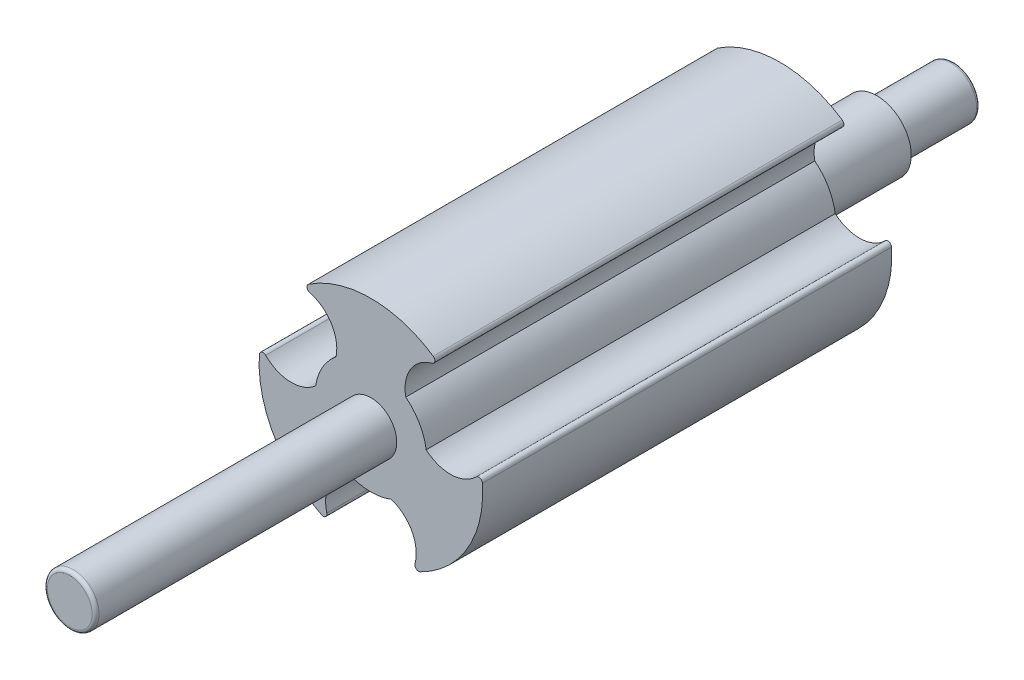
ISO-10303-21;
HEADER;
FILE_DESCRIPTION(('STEP AP214'),'2;1');
FILE_NAME('part.step','',(''),(''),'','','');
FILE_SCHEMA(('AUTOMOTIVE_DESIGN { 1 0 10303 214 1 1 1 1 }'));
ENDSEC;
DATA;
#1=APPLICATION_CONTEXT('core data for automotive mechanical design processes');
#2=APPLICATION_PROTOCOL_DEFINITION('international standard','automotive_design',2000,#1);
#3=PRODUCT_CONTEXT('',#1,'mechanical');
#4=PRODUCT('Part','Part','',(#3));
#5=PRODUCT_RELATED_PRODUCT_CATEGORY('part','',(#4));
#6=PRODUCT_DEFINITION_FORMATION('','',#4);
#7=PRODUCT_DEFINITION_CONTEXT('part definition',#1,'design');
#8=PRODUCT_DEFINITION('design','',#6,#7);
#9=PRODUCT_DEFINITION_SHAPE('','',#8);
#10=(LENGTH_UNIT() NAMED_UNIT(*) SI_UNIT(.MILLI.,.METRE.));
#11=(NAMED_UNIT(*) PLANE_ANGLE_UNIT() SI_UNIT($,.RADIAN.));
#12=(NAMED_UNIT(*) SI_UNIT($,.STERADIAN.) SOLID_ANGLE_UNIT());
#13=UNCERTAINTY_MEASURE_WITH_UNIT(LENGTH_MEASURE(1.E-05),#10,'distance_accuracy_value','');
#14=(GEOMETRIC_REPRESENTATION_CONTEXT(3) GLOBAL_UNCERTAINTY_ASSIGNED_CONTEXT((#13)) GLOBAL_UNIT_ASSIGNED_CONTEXT((#10,
#11,#12)) REPRESENTATION_CONTEXT('',''));
#15=CARTESIAN_POINT('',(0.,0.,0.));
#16=DIRECTION('',(0.,0.,1.));
#17=DIRECTION('',(1.,0.,0.));
#18=AXIS2_PLACEMENT_3D('',#15,#16,#17);
#19=CARTESIAN_POINT('',(0.,0.,-23.7702127659574));
#20=DIRECTION('',(0.,0.,1.));
#21=DIRECTION('',(0.999999999999999,0.,0.));
#22=AXIS2_PLACEMENT_3D('',#19,#20,#21);
#23=CYLINDRICAL_SURFACE('',#22,6.5);
#24=CARTESIAN_POINT('',(0.,0.,-23.7702127659574));
#25=DIRECTION('',(0.,0.,-1.));
#26=DIRECTION('',(-0.999999999999999,0.,0.));
#27=AXIS2_PLACEMENT_3D('',#24,#25,#26);
#28=CIRCLE('',#27,6.5);
#29=CARTESIAN_POINT('',(-3.6185596515465,5.39963202896276,-23.7702127659578));
#30=VERTEX_POINT('',#29);
#31=CARTESIAN_POINT('',(3.61855965154639,5.39963202896276,-23.7702127659578));
#32=VERTEX_POINT('',#31);
#33=EDGE_CURVE('E233',#30,#32,#28,.T.);
#34=ORIENTED_EDGE('',*,*,#33,.F.);
#35=DIRECTION('',(0.,0.,1.));
#36=VECTOR('',#35,1.);
#37=CARTESIAN_POINT('',(-3.6185596515465,5.39963202896276,-23.7702127659578));
#38=LINE('',#37,#36);
#39=CARTESIAN_POINT('',(-3.61855965154656,5.39963202896288,-3.05311331771918E-13));
#40=VERTEX_POINT('',#39);
#41=EDGE_CURVE('E371',#30,#40,#38,.T.);
#42=ORIENTED_EDGE('',*,*,#41,.T.);
#43=CARTESIAN_POINT('',(0.,0.,0.));
#44=DIRECTION('',(0.,0.,-1.));
#45=DIRECTION('',(-0.999999999999999,0.,0.));
#46=AXIS2_PLACEMENT_3D('',#43,#44,#45);
#47=CIRCLE('',#46,6.5);
#48=CARTESIAN_POINT('',(3.61855965154639,5.39963202896276,0.));
#49=VERTEX_POINT('',#48);
#50=EDGE_CURVE('E266',#40,#49,#47,.T.);
#51=ORIENTED_EDGE('',*,*,#50,.T.);
#52=DIRECTION('',(0.,0.,1.));
#53=VECTOR('',#52,1.);
#54=CARTESIAN_POINT('',(3.61855965154623,5.39963202896282,-23.7702127659578));
#55=LINE('',#54,#53);
#56=EDGE_CURVE('E361',#49,#32,#55,.F.);
#57=ORIENTED_EDGE('',*,*,#56,.T.);
#58=EDGE_LOOP('',(#34,#42,#51,#57));
#59=FACE_BOUND('',#58,.T.);
#60=ADVANCED_FACE('F47',(#59),#23,.T.);
#61=CARTESIAN_POINT('',(4.10030401471878,2.9653202043799,-23.7702127659578));
#62=DIRECTION('',(0.,0.,1.));
#63=DIRECTION('',(0.999999999999999,0.,0.));
#64=AXIS2_PLACEMENT_3D('',#61,#62,#63);
#65=CYLINDRICAL_SURFACE('',#64,2.11674677928763);
#66=CARTESIAN_POINT('',(4.10030401471878,2.9653202043799,-23.7702127659578));
#67=DIRECTION('',(0.,0.,1.));
#68=DIRECTION('',(0.999999999999999,0.,0.));
#69=AXIS2_PLACEMENT_3D('',#66,#67,#68);
#70=CIRCLE('',#69,2.11674677928763);
#71=CARTESIAN_POINT('',(3.55387278496899,5.01032138745486,-23.7702127659578));
#72=VERTEX_POINT('',#71);
#73=CARTESIAN_POINT('',(2.02656954019909,2.54077072927433,-23.7702127659578));
#74=VERTEX_POINT('',#73);
#75=EDGE_CURVE('E228',#72,#74,#70,.T.);
#76=ORIENTED_EDGE('',*,*,#75,.F.);
#77=DIRECTION('',(0.,0.,1.));
#78=VECTOR('',#77,1.);
#79=CARTESIAN_POINT('',(3.55387278496899,5.01032138745486,-23.7702127659578));
#80=LINE('',#79,#78);
#81=CARTESIAN_POINT('',(3.5538727849691,5.01032138745483,0.));
#82=VERTEX_POINT('',#81);
#83=EDGE_CURVE('E255',#72,#82,#80,.T.);
#84=ORIENTED_EDGE('',*,*,#83,.T.);
#85=CARTESIAN_POINT('',(4.10030401471911,2.9653202043797,-3.33066907387547E-13));
#86=DIRECTION('',(0.,0.,1.));
#87=DIRECTION('',(0.999999999999999,0.,0.));
#88=AXIS2_PLACEMENT_3D('',#85,#86,#87);
#89=CIRCLE('',#88,2.11674677928763);
#90=CARTESIAN_POINT('',(2.0265695401992,2.54077072927431,-3.05311331771918E-13));
#91=VERTEX_POINT('',#90);
#92=EDGE_CURVE('E261',#82,#91,#89,.T.);
#93=ORIENTED_EDGE('',*,*,#92,.T.);
#94=DIRECTION('',(0.,0.,1.));
#95=VECTOR('',#94,1.);
#96=CARTESIAN_POINT('',(2.02656954019909,2.54077072927433,-23.7702127659578));
#97=LINE('',#96,#95);
#98=EDGE_CURVE('E267',#74,#91,#97,.T.);
#99=ORIENTED_EDGE('',*,*,#98,.F.);
#100=EDGE_LOOP('',(#76,#84,#93,#99));
#101=FACE_BOUND('',#100,.T.);
#102=ADVANCED_FACE('F406',(#101),#65,.F.);
#103=CARTESIAN_POINT('',(0.,0.,-23.7702127659574));
#104=DIRECTION('',(0.,0.,1.));
#105=DIRECTION('',(0.999999999999999,0.,0.));
#106=AXIS2_PLACEMENT_3D('',#103,#104,#105);
#107=CYLINDRICAL_SURFACE('',#106,3.25);
#108=CARTESIAN_POINT('',(0.,0.,0.));
#109=DIRECTION('',(0.,0.,-1.));
#110=DIRECTION('',(-0.999999999999999,0.,0.));
#111=AXIS2_PLACEMENT_3D('',#108,#109,#110);
#112=CIRCLE('',#111,3.25);
#113=CARTESIAN_POINT('',(3.21365676684293,0.484675339711582,-3.05311331771918E-13));
#114=VERTEX_POINT('',#113);
#115=EDGE_CURVE('E265',#91,#114,#112,.T.);
#116=ORIENTED_EDGE('',*,*,#115,.T.);
#117=DIRECTION('',(0.,0.,1.));
#118=VECTOR('',#117,1.);
#119=CARTESIAN_POINT('',(3.21365676684282,0.484675339711416,-23.7702127659578));
#120=LINE('',#119,#118);
#121=CARTESIAN_POINT('',(3.21365676684282,0.484675339711416,-23.7702127659578));
#122=VERTEX_POINT('',#121);
#123=EDGE_CURVE('E271',#122,#114,#120,.T.);
#124=ORIENTED_EDGE('',*,*,#123,.F.);
#125=CARTESIAN_POINT('',(0.,0.,-23.7702127659575));
#126=DIRECTION('',(0.,0.,-1.));
#127=DIRECTION('',(-0.999999999999999,0.,0.));
#128=AXIS2_PLACEMENT_3D('',#125,#126,#127);
#129=CIRCLE('',#128,3.25);
#130=EDGE_CURVE('E232',#74,#122,#129,.T.);
#131=ORIENTED_EDGE('',*,*,#130,.F.);
#132=ORIENTED_EDGE('',*,*,#98,.T.);
#133=EDGE_LOOP('',(#116,#124,#131,#132));
#134=FACE_BOUND('',#133,.T.);
#135=ADVANCED_FACE('F412',(#134),#107,.T.);
#136=CARTESIAN_POINT('',(4.61819463470758,2.06830733779634,-23.7702127659578));
#137=DIRECTION('',(0.,0.,1.));
#138=DIRECTION('',(0.999999999999999,0.,0.));
#139=AXIS2_PLACEMENT_3D('',#136,#137,#138);
#140=CYLINDRICAL_SURFACE('',#139,2.11674677928763);
#141=CARTESIAN_POINT('',(4.61819463470764,2.06830733779634,-3.33066907387547E-13));
#142=DIRECTION('',(0.,0.,1.));
#143=DIRECTION('',(0.999999999999999,0.,0.));
#144=AXIS2_PLACEMENT_3D('',#141,#142,#143);
#145=CIRCLE('',#144,2.11674677928763);
#146=CARTESIAN_POINT('',(6.11600199514467,0.572583419874317,-3.33066907387547E-13));
#147=VERTEX_POINT('',#146);
#148=EDGE_CURVE('E275',#114,#147,#145,.T.);
#149=ORIENTED_EDGE('',*,*,#148,.T.);
#150=DIRECTION('',(0.,0.,1.));
#151=VECTOR('',#150,1.);
#152=CARTESIAN_POINT('',(6.11600199514462,0.572583419874262,-23.7702127659578));
#153=LINE('',#152,#151);
#154=CARTESIAN_POINT('',(6.11600199514462,0.572583419874262,-23.7702127659578));
#155=VERTEX_POINT('',#154);
#156=EDGE_CURVE('E284',#147,#155,#153,.F.);
#157=ORIENTED_EDGE('',*,*,#156,.T.);
#158=CARTESIAN_POINT('',(4.61819463470758,2.06830733779634,-23.7702127659578));
#159=DIRECTION('',(0.,0.,1.));
#160=DIRECTION('',(0.999999999999999,0.,0.));
#161=AXIS2_PLACEMENT_3D('',#158,#159,#160);
#162=CIRCLE('',#161,2.11674677928763);
#163=EDGE_CURVE('E237',#122,#155,#162,.T.);
#164=ORIENTED_EDGE('',*,*,#163,.F.);
#165=ORIENTED_EDGE('',*,*,#123,.T.);
#166=EDGE_LOOP('',(#149,#157,#164,#165));
#167=FACE_BOUND('',#166,.T.);
#168=ADVANCED_FACE('F422',(#167),#140,.F.);
#169=CARTESIAN_POINT('',(0.,0.,-23.7702127659574));
#170=DIRECTION('',(0.,0.,1.));
#171=DIRECTION('',(0.999999999999999,0.,0.));
#172=AXIS2_PLACEMENT_3D('',#169,#170,#171);
#173=CYLINDRICAL_SURFACE('',#172,6.5);
#174=CARTESIAN_POINT('',(0.,0.,0.));
#175=DIRECTION('',(0.,0.,-1.));
#176=DIRECTION('',(-0.999999999999999,0.,0.));
#177=AXIS2_PLACEMENT_3D('',#174,#175,#176);
#178=CIRCLE('',#177,6.5);
#179=CARTESIAN_POINT('',(6.48549833394302,0.433948568867304,-3.33066907387547E-13));
#180=VERTEX_POINT('',#179);
#181=CARTESIAN_POINT('',(2.86693868239657,-5.83358059782985,0.));
#182=VERTEX_POINT('',#181);
#183=EDGE_CURVE('E283',#180,#182,#178,.T.);
#184=ORIENTED_EDGE('',*,*,#183,.T.);
#185=DIRECTION('',(0.,0.,1.));
#186=VECTOR('',#185,1.);
#187=CARTESIAN_POINT('',(2.86693868239657,-5.83358059782985,-23.7702127659574));
#188=LINE('',#187,#186);
#189=CARTESIAN_POINT('',(2.86693868239657,-5.83358059782985,-23.7702127659574));
#190=VERTEX_POINT('',#189);
#191=EDGE_CURVE('E289',#182,#190,#188,.F.);
#192=ORIENTED_EDGE('',*,*,#191,.T.);
#193=CARTESIAN_POINT('',(0.,0.,-23.7702127659574));
#194=DIRECTION('',(0.,0.,-1.));
#195=DIRECTION('',(-0.999999999999999,0.,0.));
#196=AXIS2_PLACEMENT_3D('',#193,#194,#195);
#197=CIRCLE('',#196,6.5);
#198=CARTESIAN_POINT('',(6.48549833394302,0.433948568867304,-23.7702127659578));
#199=VERTEX_POINT('',#198);
#200=EDGE_CURVE('E241',#199,#190,#197,.T.);
#201=ORIENTED_EDGE('',*,*,#200,.F.);
#202=DIRECTION('',(0.,0.,1.));
#203=VECTOR('',#202,1.);
#204=CARTESIAN_POINT('',(6.48549833394302,0.433948568867304,-23.7702127659578));
#205=LINE('',#204,#203);
#206=EDGE_CURVE('E339',#199,#180,#205,.T.);
#207=ORIENTED_EDGE('',*,*,#206,.T.);
#208=EDGE_LOOP('',(#184,#192,#201,#207));
#209=FACE_BOUND('',#208,.T.);
#210=ADVANCED_FACE('F426',(#209),#173,.T.);
#211=CARTESIAN_POINT('',(0.517890619988137,-5.03362754217568,-23.7702127659575));
#212=DIRECTION('',(0.,0.,1.));
#213=DIRECTION('',(0.999999999999999,0.,0.));
#214=AXIS2_PLACEMENT_3D('',#211,#212,#213);
#215=CYLINDRICAL_SURFACE('',#214,2.11674677928763);
#216=CARTESIAN_POINT('',(0.517890619988137,-5.03362754217568,-23.7702127659575));
#217=DIRECTION('',(0.,0.,1.));
#218=DIRECTION('',(0.999999999999999,0.,0.));
#219=AXIS2_PLACEMENT_3D('',#216,#217,#218);
#220=CIRCLE('',#219,2.11674677928763);
#221=CARTESIAN_POINT('',(2.5621292101754,-5.58290480732832,-23.7702127659574));
#222=VERTEX_POINT('',#221);
#223=CARTESIAN_POINT('',(1.18708722664335,-3.02544606898508,-23.7702127659574));
#224=VERTEX_POINT('',#223);
#225=EDGE_CURVE('E247',#222,#224,#220,.T.);
#226=ORIENTED_EDGE('',*,*,#225,.F.);
#227=DIRECTION('',(0.,0.,1.));
#228=VECTOR('',#227,1.);
#229=CARTESIAN_POINT('',(2.5621292101754,-5.58290480732832,-23.7702127659574));
#230=LINE('',#229,#228);
#231=CARTESIAN_POINT('',(2.56212921017562,-5.58290480732854,0.));
#232=VERTEX_POINT('',#231);
#233=EDGE_CURVE('E186',#222,#232,#230,.T.);
#234=ORIENTED_EDGE('',*,*,#233,.T.);
#235=CARTESIAN_POINT('',(0.517890619988415,-5.03362754217584,0.));
#236=DIRECTION('',(0.,0.,1.));
#237=DIRECTION('',(0.999999999999999,0.,0.));
#238=AXIS2_PLACEMENT_3D('',#235,#236,#237);
#239=CIRCLE('',#238,2.11674677928763);
#240=CARTESIAN_POINT('',(1.18708722664357,-3.02544606898514,0.));
#241=VERTEX_POINT('',#240);
#242=EDGE_CURVE('E305',#232,#241,#239,.T.);
#243=ORIENTED_EDGE('',*,*,#242,.T.);
#244=DIRECTION('',(0.,0.,1.));
#245=VECTOR('',#244,1.);
#246=CARTESIAN_POINT('',(1.18708722664335,-3.02544606898508,-23.7702127659574));
#247=LINE('',#246,#245);
#248=EDGE_CURVE('E279',#224,#241,#247,.T.);
#249=ORIENTED_EDGE('',*,*,#248,.F.);
#250=EDGE_LOOP('',(#226,#234,#243,#249));
#251=FACE_BOUND('',#250,.T.);
#252=ADVANCED_FACE('F430',(#251),#215,.F.);
#253=CARTESIAN_POINT('',(0.,0.,-23.7702127659574));
#254=DIRECTION('',(0.,0.,1.));
#255=DIRECTION('',(0.999999999999999,0.,0.));
#256=AXIS2_PLACEMENT_3D('',#253,#254,#255);
#257=CYLINDRICAL_SURFACE('',#256,3.25);
#258=CARTESIAN_POINT('',(0.,0.,0.));
#259=DIRECTION('',(0.,0.,-1.));
#260=DIRECTION('',(-0.999999999999999,0.,0.));
#261=AXIS2_PLACEMENT_3D('',#258,#259,#260);
#262=CIRCLE('',#261,3.25);
#263=CARTESIAN_POINT('',(-1.18708722664373,-3.0254460689853,0.));
#264=VERTEX_POINT('',#263);
#265=EDGE_CURVE('E301',#241,#264,#262,.T.);
#266=ORIENTED_EDGE('',*,*,#265,.T.);
#267=DIRECTION('',(0.,0.,1.));
#268=VECTOR('',#267,1.);
#269=CARTESIAN_POINT('',(-1.18708722664379,-3.02544606898536,-23.7702127659575));
#270=LINE('',#269,#268);
#271=CARTESIAN_POINT('',(-1.18708722664379,-3.02544606898536,-23.7702127659575));
#272=VERTEX_POINT('',#271);
#273=EDGE_CURVE('E349',#272,#264,#270,.T.);
#274=ORIENTED_EDGE('',*,*,#273,.F.);
#275=CARTESIAN_POINT('',(0.,0.,-23.7702127659574));
#276=DIRECTION('',(0.,0.,-1.));
#277=DIRECTION('',(0.,1.,0.));
#278=AXIS2_PLACEMENT_3D('',#275,#276,#277);
#279=CIRCLE('',#278,3.25);
#280=EDGE_CURVE('E209',#224,#272,#279,.T.);
#281=ORIENTED_EDGE('',*,*,#280,.F.);
#282=ORIENTED_EDGE('',*,*,#248,.T.);
#283=EDGE_LOOP('',(#266,#274,#281,#282));
#284=FACE_BOUND('',#283,.T.);
#285=ADVANCED_FACE('F434',(#284),#257,.T.);
#286=CARTESIAN_POINT('',(-0.517890619988581,-5.03362754217587,-23.7702127659578));
#287=DIRECTION('',(0.,0.,1.));
#288=DIRECTION('',(0.999999999999999,0.,0.));
#289=AXIS2_PLACEMENT_3D('',#286,#287,#288);
#290=CYLINDRICAL_SURFACE('',#289,2.11674677928763);
#291=CARTESIAN_POINT('',(-0.517890619988526,-5.0336275421759,0.));
#292=DIRECTION('',(0.,0.,1.));
#293=DIRECTION('',(0.999999999999999,0.,0.));
#294=AXIS2_PLACEMENT_3D('',#291,#292,#293);
#295=CIRCLE('',#294,2.11674677928763);
#296=CARTESIAN_POINT('',(-2.56212921017585,-5.5829048073287,-3.33066907387547E-13));
#297=VERTEX_POINT('',#296);
#298=EDGE_CURVE('E294',#264,#297,#295,.T.);
#299=ORIENTED_EDGE('',*,*,#298,.T.);
#300=DIRECTION('',(0.,0.,1.));
#301=VECTOR('',#300,1.);
#302=CARTESIAN_POINT('',(-2.56212921017601,-5.58290480732854,-23.7702127659578));
#303=LINE('',#302,#301);
#304=CARTESIAN_POINT('',(-2.56212921017601,-5.58290480732854,-23.7702127659578));
#305=VERTEX_POINT('',#304);
#306=EDGE_CURVE('E227',#297,#305,#303,.F.);
#307=ORIENTED_EDGE('',*,*,#306,.T.);
#308=CARTESIAN_POINT('',(-0.517890619988581,-5.03362754217587,-23.7702127659578));
#309=DIRECTION('',(0.,0.,1.));
#310=DIRECTION('',(0.999999999999999,0.,0.));
#311=AXIS2_PLACEMENT_3D('',#308,#309,#310);
#312=CIRCLE('',#311,2.11674677928763);
#313=EDGE_CURVE('E181',#272,#305,#312,.T.);
#314=ORIENTED_EDGE('',*,*,#313,.F.);
#315=ORIENTED_EDGE('',*,*,#273,.T.);
#316=EDGE_LOOP('',(#299,#307,#314,#315));
#317=FACE_BOUND('',#316,.T.);
#318=ADVANCED_FACE('F438',(#317),#290,.F.);
#319=CARTESIAN_POINT('',(0.,0.,-23.7702127659574));
#320=DIRECTION('',(0.,0.,1.));
#321=DIRECTION('',(0.999999999999999,0.,0.));
#322=AXIS2_PLACEMENT_3D('',#319,#320,#321);
#323=CYLINDRICAL_SURFACE('',#322,6.5);
#324=CARTESIAN_POINT('',(0.,0.,-23.7702127659574));
#325=DIRECTION('',(0.,0.,-1.));
#326=DIRECTION('',(-0.999999999999999,0.,0.));
#327=AXIS2_PLACEMENT_3D('',#324,#325,#326);
#328=CIRCLE('',#327,6.5);
#329=CARTESIAN_POINT('',(-2.86693868239668,-5.83358059782985,-23.7702127659578));
#330=VERTEX_POINT('',#329);
#331=CARTESIAN_POINT('',(-6.48549833394324,0.433948568867387,-23.7702127659578));
#332=VERTEX_POINT('',#331);
#333=EDGE_CURVE('E179',#330,#332,#328,.T.);
#334=ORIENTED_EDGE('',*,*,#333,.F.);
#335=DIRECTION('',(0.,0.,1.));
#336=VECTOR('',#335,1.);
#337=CARTESIAN_POINT('',(-2.86693868239668,-5.83358059782985,-23.7702127659578));
#338=LINE('',#337,#336);
#339=CARTESIAN_POINT('',(-2.86693868239685,-5.83358059782976,-3.33066907387547E-13));
#340=VERTEX_POINT('',#339);
#341=EDGE_CURVE('E190',#330,#340,#338,.T.);
#342=ORIENTED_EDGE('',*,*,#341,.T.);
#343=CARTESIAN_POINT('',(0.,0.,0.));
#344=DIRECTION('',(0.,0.,-1.));
#345=DIRECTION('',(-0.999999999999999,0.,0.));
#346=AXIS2_PLACEMENT_3D('',#343,#344,#345);
#347=CIRCLE('',#346,6.5);
#348=CARTESIAN_POINT('',(-6.48549833394324,0.433948568867387,0.));
#349=VERTEX_POINT('',#348);
#350=EDGE_CURVE('E290',#340,#349,#347,.T.);
#351=ORIENTED_EDGE('',*,*,#350,.T.);
#352=DIRECTION('',(0.,0.,1.));
#353=VECTOR('',#352,1.);
#354=CARTESIAN_POINT('',(-6.48549833394324,0.433948568867387,-23.7702127659578));
#355=LINE('',#354,#353);
#356=EDGE_CURVE('E198',#349,#332,#355,.F.);
#357=ORIENTED_EDGE('',*,*,#356,.T.);
#358=EDGE_LOOP('',(#334,#342,#351,#357));
#359=FACE_BOUND('',#358,.T.);
#360=ADVANCED_FACE('F200',(#359),#323,.T.);
#361=CARTESIAN_POINT('',(-4.61819463470775,2.06830733779645,-23.7702127659575));
#362=DIRECTION('',(0.,0.,1.));
#363=DIRECTION('',(0.999999999999999,0.,0.));
#364=AXIS2_PLACEMENT_3D('',#361,#362,#363);
#365=CYLINDRICAL_SURFACE('',#364,2.11674677928763);
#366=CARTESIAN_POINT('',(-4.61819463470775,2.06830733779645,-23.7702127659575));
#367=DIRECTION('',(0.,0.,1.));
#368=DIRECTION('',(0.999999999999999,0.,0.));
#369=AXIS2_PLACEMENT_3D('',#366,#367,#368);
#370=CIRCLE('',#369,2.11674677928763);
#371=CARTESIAN_POINT('',(-6.116001995145,0.572583419874068,-23.7702127659578));
#372=VERTEX_POINT('',#371);
#373=CARTESIAN_POINT('',(-3.2136567668431,0.484675339711416,-23.7702127659575));
#374=VERTEX_POINT('',#373);
#375=EDGE_CURVE('E202',#372,#374,#370,.T.);
#376=ORIENTED_EDGE('',*,*,#375,.F.);
#377=DIRECTION('',(0.,0.,1.));
#378=VECTOR('',#377,1.);
#379=CARTESIAN_POINT('',(-6.116001995145,0.572583419874068,-23.7702127659578));
#380=LINE('',#379,#378);
#381=CARTESIAN_POINT('',(-6.116001995145,0.572583419874095,0.));
#382=VERTEX_POINT('',#381);
#383=EDGE_CURVE('E288',#372,#382,#380,.T.);
#384=ORIENTED_EDGE('',*,*,#383,.T.);
#385=CARTESIAN_POINT('',(-4.61819463470764,2.06830733779634,0.));
#386=DIRECTION('',(0.,0.,1.));
#387=DIRECTION('',(0.999999999999999,0.,0.));
#388=AXIS2_PLACEMENT_3D('',#385,#386,#387);
#389=CIRCLE('',#388,2.11674677928763);
#390=CARTESIAN_POINT('',(-3.2136567668431,0.484675339711416,0.));
#391=VERTEX_POINT('',#390);
#392=EDGE_CURVE('E293',#382,#391,#389,.T.);
#393=ORIENTED_EDGE('',*,*,#392,.T.);
#394=DIRECTION('',(0.,0.,1.));
#395=VECTOR('',#394,1.);
#396=CARTESIAN_POINT('',(-3.2136567668431,0.484675339711416,-23.7702127659575));
#397=LINE('',#396,#395);
#398=EDGE_CURVE('E353',#374,#391,#397,.T.);
#399=ORIENTED_EDGE('',*,*,#398,.F.);
#400=EDGE_LOOP('',(#376,#384,#393,#399));
#401=FACE_BOUND('',#400,.T.);
#402=ADVANCED_FACE('F445',(#401),#365,.F.);
#403=CARTESIAN_POINT('',(0.,0.,-23.7702127659574));
#404=DIRECTION('',(0.,0.,1.));
#405=DIRECTION('',(0.999999999999999,0.,0.));
#406=AXIS2_PLACEMENT_3D('',#403,#404,#405);
#407=CYLINDRICAL_SURFACE('',#406,3.25);
#408=CARTESIAN_POINT('',(0.,0.,0.));
#409=DIRECTION('',(0.,0.,-1.));
#410=DIRECTION('',(-0.999999999999999,0.,0.));
#411=AXIS2_PLACEMENT_3D('',#408,#409,#410);
#412=CIRCLE('',#411,3.25000000000001);
#413=CARTESIAN_POINT('',(-2.02656954019936,2.54077072927428,-3.05311331771918E-13));
#414=VERTEX_POINT('',#413);
#415=EDGE_CURVE('E327',#391,#414,#412,.T.);
#416=ORIENTED_EDGE('',*,*,#415,.T.);
#417=DIRECTION('',(0.,0.,1.));
#418=VECTOR('',#417,1.);
#419=CARTESIAN_POINT('',(-2.02656954019942,2.54077072927425,-23.7702127659578));
#420=LINE('',#419,#418);
#421=CARTESIAN_POINT('',(-2.02656954019942,2.54077072927425,-23.7702127659578));
#422=VERTEX_POINT('',#421);
#423=EDGE_CURVE('E221',#422,#414,#420,.T.);
#424=ORIENTED_EDGE('',*,*,#423,.F.);
#425=CARTESIAN_POINT('',(0.,0.,-23.7702127659575));
#426=DIRECTION('',(0.,0.,-1.));
#427=DIRECTION('',(-0.999999999999999,0.,0.));
#428=AXIS2_PLACEMENT_3D('',#425,#426,#427);
#429=CIRCLE('',#428,3.25000000000001);
#430=EDGE_CURVE('E207',#374,#422,#429,.T.);
#431=ORIENTED_EDGE('',*,*,#430,.F.);
#432=ORIENTED_EDGE('',*,*,#398,.T.);
#433=EDGE_LOOP('',(#416,#424,#431,#432));
#434=FACE_BOUND('',#433,.T.);
#435=ADVANCED_FACE('F448',(#434),#407,.T.);
#436=CARTESIAN_POINT('',(-4.10030401471939,2.9653202043799,-23.7702127659574));
#437=DIRECTION('',(0.,0.,1.));
#438=DIRECTION('',(0.999999999999999,0.,0.));
#439=AXIS2_PLACEMENT_3D('',#436,#437,#438);
#440=CYLINDRICAL_SURFACE('',#439,2.11674677928763);
#441=CARTESIAN_POINT('',(-4.10030401471922,2.96532020437984,0.));
#442=DIRECTION('',(0.,0.,1.));
#443=DIRECTION('',(0.999999999999999,0.,0.));
#444=AXIS2_PLACEMENT_3D('',#441,#442,#443);
#445=CIRCLE('',#444,2.11674677928763);
#446=CARTESIAN_POINT('',(-3.55387278496927,5.01032138745511,-3.05311331771918E-13));
#447=VERTEX_POINT('',#446);
#448=EDGE_CURVE('E323',#414,#447,#445,.T.);
#449=ORIENTED_EDGE('',*,*,#448,.T.);
#450=DIRECTION('',(0.,0.,1.));
#451=VECTOR('',#450,1.);
#452=CARTESIAN_POINT('',(-3.55387278496933,5.010321387455,-23.7702127659578));
#453=LINE('',#452,#451);
#454=CARTESIAN_POINT('',(-3.55387278496933,5.010321387455,-23.7702127659578));
#455=VERTEX_POINT('',#454);
#456=EDGE_CURVE('E260',#447,#455,#453,.F.);
#457=ORIENTED_EDGE('',*,*,#456,.T.);
#458=CARTESIAN_POINT('',(-4.10030401471939,2.9653202043799,-23.7702127659574));
#459=DIRECTION('',(0.,0.,1.));
#460=DIRECTION('',(0.999999999999999,0.,0.));
#461=AXIS2_PLACEMENT_3D('',#458,#459,#460);
#462=CIRCLE('',#461,2.11674677928763);
#463=EDGE_CURVE('E218',#422,#455,#462,.T.);
#464=ORIENTED_EDGE('',*,*,#463,.F.);
#465=ORIENTED_EDGE('',*,*,#423,.T.);
#466=EDGE_LOOP('',(#449,#457,#464,#465));
#467=FACE_BOUND('',#466,.T.);
#468=ADVANCED_FACE('F452',(#467),#440,.F.);
#469=CARTESIAN_POINT('',(2.05015200735914,1.4826601021902,-23.7702127659578));
#470=DIRECTION('',(0.,0.,-1.));
#471=DIRECTION('',(-0.999999999999999,0.,0.));
#472=AXIS2_PLACEMENT_3D('',#469,#470,#471);
#473=PLANE('',#472);
#474=CARTESIAN_POINT('',(0.,0.,-23.7702127659574));
#475=DIRECTION('',(0.,0.,1.));
#476=DIRECTION('',(0.999999999999999,0.,0.));
#477=AXIS2_PLACEMENT_3D('',#474,#475,#476);
#478=CIRCLE('',#477,2.);
#479=CARTESIAN_POINT('',(1.99999999999994,0.,-23.7702127659574));
#480=VERTEX_POINT('',#479);
#481=EDGE_CURVE('E259',#480,#480,#478,.T.);
#482=ORIENTED_EDGE('',*,*,#481,.T.);
#483=EDGE_LOOP('',(#482));
#484=FACE_BOUND('',#483,.T.);
#485=ORIENTED_EDGE('',*,*,#313,.T.);
#486=CARTESIAN_POINT('',(-2.77137405965022,-5.63912791123544,-23.7702127659578));
#487=DIRECTION('',(0.,0.,-1.));
#488=DIRECTION('',(-0.999999999999999,0.,0.));
#489=AXIS2_PLACEMENT_3D('',#486,#487,#488);
#490=CIRCLE('',#489,0.216666666666667);
#491=EDGE_CURVE('E175',#305,#330,#490,.T.);
#492=ORIENTED_EDGE('',*,*,#491,.T.);
#493=ORIENTED_EDGE('',*,*,#333,.T.);
#494=CARTESIAN_POINT('',(-6.26931505614514,0.419483616571792,-23.7702127659578));
#495=DIRECTION('',(0.,0.,-1.));
#496=DIRECTION('',(-0.999999999999999,0.,0.));
#497=AXIS2_PLACEMENT_3D('',#494,#495,#496);
#498=CIRCLE('',#497,0.216666666666666);
#499=EDGE_CURVE('E72',#332,#372,#498,.T.);
#500=ORIENTED_EDGE('',*,*,#499,.T.);
#501=ORIENTED_EDGE('',*,*,#375,.T.);
#502=ORIENTED_EDGE('',*,*,#430,.T.);
#503=ORIENTED_EDGE('',*,*,#463,.T.);
#504=CARTESIAN_POINT('',(-3.4979409964952,5.21964429466415,-23.7702127659578));
#505=DIRECTION('',(0.,0.,-1.));
#506=DIRECTION('',(-0.999999999999999,0.,0.));
#507=AXIS2_PLACEMENT_3D('',#504,#505,#506);
#508=CIRCLE('',#507,0.216666666666666);
#509=EDGE_CURVE('E63',#455,#30,#508,.T.);
#510=ORIENTED_EDGE('',*,*,#509,.T.);
#511=ORIENTED_EDGE('',*,*,#33,.T.);
#512=CARTESIAN_POINT('',(3.49794099649475,5.21964429466409,-23.7702127659578));
#513=DIRECTION('',(0.,0.,-1.));
#514=DIRECTION('',(-0.999999999999999,0.,0.));
#515=AXIS2_PLACEMENT_3D('',#512,#513,#514);
#516=CIRCLE('',#515,0.216666666666666);
#517=EDGE_CURVE('E224',#32,#72,#516,.T.);
#518=ORIENTED_EDGE('',*,*,#517,.T.);
#519=ORIENTED_EDGE('',*,*,#75,.T.);
#520=ORIENTED_EDGE('',*,*,#130,.T.);
#521=ORIENTED_EDGE('',*,*,#163,.T.);
#522=CARTESIAN_POINT('',(6.26931505614459,0.419483616571847,-23.7702127659578));
#523=DIRECTION('',(0.,0.,-1.));
#524=DIRECTION('',(0.,1.,0.));
#525=AXIS2_PLACEMENT_3D('',#522,#523,#524);
#526=CIRCLE('',#525,0.216666666666667);
#527=EDGE_CURVE('E213',#155,#199,#526,.T.);
#528=ORIENTED_EDGE('',*,*,#527,.T.);
#529=ORIENTED_EDGE('',*,*,#200,.T.);
#530=CARTESIAN_POINT('',(2.77137405964983,-5.63912791123528,-23.7702127659574));
#531=DIRECTION('',(0.,0.,-1.));
#532=DIRECTION('',(-0.999999999999999,0.,0.));
#533=AXIS2_PLACEMENT_3D('',#530,#531,#532);
#534=CIRCLE('',#533,0.216666666666667);
#535=EDGE_CURVE('E187',#190,#222,#534,.T.);
#536=ORIENTED_EDGE('',*,*,#535,.T.);
#537=ORIENTED_EDGE('',*,*,#225,.T.);
#538=ORIENTED_EDGE('',*,*,#280,.T.);
#539=EDGE_LOOP('',(#485,#492,#493,#500,#501,#502,#503,#510,#511,#518,#519,#520,#521,#528,#529,
#536,#537,#538));
#540=FACE_BOUND('',#539,.T.);
#541=ADVANCED_FACE('F177',(#484,#540),#473,.T.);
#542=CARTESIAN_POINT('',(2.05015200735936,1.48266010219009,-3.05311331771918E-13));
#543=DIRECTION('',(0.,0.,-1.));
#544=DIRECTION('',(-0.999999999999999,0.,0.));
#545=AXIS2_PLACEMENT_3D('',#542,#543,#544);
#546=PLANE('',#545);
#547=CARTESIAN_POINT('',(0.,0.,0.));
#548=DIRECTION('',(0.,0.,-1.));
#549=DIRECTION('',(-0.999999999999999,0.,0.));
#550=AXIS2_PLACEMENT_3D('',#547,#548,#549);
#551=CIRCLE('',#550,1.5);
#552=CARTESIAN_POINT('',(-1.5,0.,0.));
#553=VERTEX_POINT('',#552);
#554=EDGE_CURVE('E387',#553,#553,#551,.F.);
#555=ORIENTED_EDGE('',*,*,#554,.F.);
#556=EDGE_LOOP('',(#555));
#557=FACE_BOUND('',#556,.T.);
#558=ORIENTED_EDGE('',*,*,#350,.F.);
#559=CARTESIAN_POINT('',(-2.77137405965022,-5.63912791123544,-3.33066907387547E-13));
#560=DIRECTION('',(0.,0.,1.));
#561=DIRECTION('',(0.999999999999999,0.,0.));
#562=AXIS2_PLACEMENT_3D('',#559,#560,#561);
#563=CIRCLE('',#562,0.216666666666667);
#564=EDGE_CURVE('E192',#340,#297,#563,.T.);
#565=ORIENTED_EDGE('',*,*,#564,.T.);
#566=ORIENTED_EDGE('',*,*,#298,.F.);
#567=ORIENTED_EDGE('',*,*,#265,.F.);
#568=ORIENTED_EDGE('',*,*,#242,.F.);
#569=CARTESIAN_POINT('',(2.77137405965006,-5.63912791123555,0.));
#570=DIRECTION('',(0.,0.,1.));
#571=DIRECTION('',(0.999999999999999,0.,0.));
#572=AXIS2_PLACEMENT_3D('',#569,#570,#571);
#573=CIRCLE('',#572,0.216666666666667);
#574=EDGE_CURVE('E297',#232,#182,#573,.T.);
#575=ORIENTED_EDGE('',*,*,#574,.T.);
#576=ORIENTED_EDGE('',*,*,#183,.F.);
#577=CARTESIAN_POINT('',(6.26931505614453,0.419483616572014,-3.33066907387547E-13));
#578=DIRECTION('',(0.,0.,1.));
#579=DIRECTION('',(0.999999999999999,0.,0.));
#580=AXIS2_PLACEMENT_3D('',#577,#578,#579);
#581=CIRCLE('',#580,0.216666666666667);
#582=EDGE_CURVE('E311',#180,#147,#581,.T.);
#583=ORIENTED_EDGE('',*,*,#582,.T.);
#584=ORIENTED_EDGE('',*,*,#148,.F.);
#585=ORIENTED_EDGE('',*,*,#115,.F.);
#586=ORIENTED_EDGE('',*,*,#92,.F.);
#587=CARTESIAN_POINT('',(3.49794099649486,5.2196442946642,0.));
#588=DIRECTION('',(0.,0.,1.));
#589=DIRECTION('',(0.999999999999999,0.,0.));
#590=AXIS2_PLACEMENT_3D('',#587,#588,#589);
#591=CIRCLE('',#590,0.216666666666666);
#592=EDGE_CURVE('E197',#82,#49,#591,.T.);
#593=ORIENTED_EDGE('',*,*,#592,.T.);
#594=ORIENTED_EDGE('',*,*,#50,.F.);
#595=CARTESIAN_POINT('',(-3.4979409964952,5.21964429466415,-3.05311331771918E-13));
#596=DIRECTION('',(0.,0.,1.));
#597=DIRECTION('',(0.999999999999999,0.,0.));
#598=AXIS2_PLACEMENT_3D('',#595,#596,#597);
#599=CIRCLE('',#598,0.216666666666666);
#600=EDGE_CURVE('E320',#40,#447,#599,.T.);
#601=ORIENTED_EDGE('',*,*,#600,.T.);
#602=ORIENTED_EDGE('',*,*,#448,.F.);
#603=ORIENTED_EDGE('',*,*,#415,.F.);
#604=ORIENTED_EDGE('',*,*,#392,.F.);
#605=CARTESIAN_POINT('',(-6.26931505614503,0.419483616571681,0.));
#606=DIRECTION('',(0.,0.,1.));
#607=DIRECTION('',(0.999999999999999,0.,0.));
#608=AXIS2_PLACEMENT_3D('',#605,#606,#607);
#609=CIRCLE('',#608,0.216666666666666);
#610=EDGE_CURVE('E317',#382,#349,#609,.T.);
#611=ORIENTED_EDGE('',*,*,#610,.T.);
#612=EDGE_LOOP('',(#558,#565,#566,#567,#568,#575,#576,#583,#584,#585,#586,#593,#594,#601,#602,
#603,#604,#611));
#613=FACE_BOUND('',#612,.T.);
#614=ADVANCED_FACE('F459',(#557,#613),#546,.F.);
#615=CARTESIAN_POINT('',(-2.77137405965022,-5.63912791123544,-23.7702127659578));
#616=DIRECTION('',(0.,0.,-1.));
#617=DIRECTION('',(-0.999999999999999,0.,0.));
#618=AXIS2_PLACEMENT_3D('',#615,#616,#617);
#619=CYLINDRICAL_SURFACE('',#618,0.216666666666667);
#620=ORIENTED_EDGE('',*,*,#491,.F.);
#621=ORIENTED_EDGE('',*,*,#306,.F.);
#622=ORIENTED_EDGE('',*,*,#564,.F.);
#623=ORIENTED_EDGE('',*,*,#341,.F.);
#624=EDGE_LOOP('',(#620,#621,#622,#623));
#625=FACE_BOUND('',#624,.T.);
#626=ADVANCED_FACE('F191',(#625),#619,.T.);
#627=CARTESIAN_POINT('',(2.77137405964983,-5.63912791123528,-23.7702127659574));
#628=DIRECTION('',(0.,0.,-1.));
#629=DIRECTION('',(-0.999999999999999,0.,0.));
#630=AXIS2_PLACEMENT_3D('',#627,#628,#629);
#631=CYLINDRICAL_SURFACE('',#630,0.216666666666666);
#632=ORIENTED_EDGE('',*,*,#535,.F.);
#633=ORIENTED_EDGE('',*,*,#191,.F.);
#634=ORIENTED_EDGE('',*,*,#574,.F.);
#635=ORIENTED_EDGE('',*,*,#233,.F.);
#636=EDGE_LOOP('',(#632,#633,#634,#635));
#637=FACE_BOUND('',#636,.T.);
#638=ADVANCED_FACE('F466',(#637),#631,.T.);
#639=CARTESIAN_POINT('',(6.26931505614459,0.419483616571847,-23.7702127659578));
#640=DIRECTION('',(0.,0.,-1.));
#641=DIRECTION('',(-0.999999999999999,0.,0.));
#642=AXIS2_PLACEMENT_3D('',#639,#640,#641);
#643=CYLINDRICAL_SURFACE('',#642,0.216666666666667);
#644=ORIENTED_EDGE('',*,*,#527,.F.);
#645=ORIENTED_EDGE('',*,*,#156,.F.);
#646=ORIENTED_EDGE('',*,*,#582,.F.);
#647=ORIENTED_EDGE('',*,*,#206,.F.);
#648=EDGE_LOOP('',(#644,#645,#646,#647));
#649=FACE_BOUND('',#648,.T.);
#650=ADVANCED_FACE('F469',(#649),#643,.T.);
#651=CARTESIAN_POINT('',(-6.26931505614514,0.419483616571792,-23.7702127659578));
#652=DIRECTION('',(0.,0.,-1.));
#653=DIRECTION('',(-0.999999999999999,0.,0.));
#654=AXIS2_PLACEMENT_3D('',#651,#652,#653);
#655=CYLINDRICAL_SURFACE('',#654,0.216666666666667);
#656=ORIENTED_EDGE('',*,*,#499,.F.);
#657=ORIENTED_EDGE('',*,*,#356,.F.);
#658=ORIENTED_EDGE('',*,*,#610,.F.);
#659=ORIENTED_EDGE('',*,*,#383,.F.);
#660=EDGE_LOOP('',(#656,#657,#658,#659));
#661=FACE_BOUND('',#660,.T.);
#662=ADVANCED_FACE('F473',(#661),#655,.T.);
#663=CARTESIAN_POINT('',(-3.4979409964952,5.21964429466415,-23.7702127659578));
#664=DIRECTION('',(0.,0.,-1.));
#665=DIRECTION('',(-0.999999999999999,0.,0.));
#666=AXIS2_PLACEMENT_3D('',#663,#664,#665);
#667=CYLINDRICAL_SURFACE('',#666,0.216666666666667);
#668=ORIENTED_EDGE('',*,*,#509,.F.);
#669=ORIENTED_EDGE('',*,*,#456,.F.);
#670=ORIENTED_EDGE('',*,*,#600,.F.);
#671=ORIENTED_EDGE('',*,*,#41,.F.);
#672=EDGE_LOOP('',(#668,#669,#670,#671));
#673=FACE_BOUND('',#672,.T.);
#674=ADVANCED_FACE('F477',(#673),#667,.T.);
#675=CARTESIAN_POINT('',(3.49794099649475,5.21964429466409,-23.7702127659578));
#676=DIRECTION('',(0.,0.,-1.));
#677=DIRECTION('',(-0.999999999999999,0.,0.));
#678=AXIS2_PLACEMENT_3D('',#675,#676,#677);
#679=CYLINDRICAL_SURFACE('',#678,0.216666666666667);
#680=ORIENTED_EDGE('',*,*,#517,.F.);
#681=ORIENTED_EDGE('',*,*,#56,.F.);
#682=ORIENTED_EDGE('',*,*,#592,.F.);
#683=ORIENTED_EDGE('',*,*,#83,.F.);
#684=EDGE_LOOP('',(#680,#681,#682,#683));
#685=FACE_BOUND('',#684,.T.);
#686=ADVANCED_FACE('F480',(#685),#679,.T.);
#687=CARTESIAN_POINT('',(0.,0.,-35.0568542494924));
#688=DIRECTION('',(0.,0.,1.));
#689=DIRECTION('',(0.999999999999999,0.,0.));
#690=AXIS2_PLACEMENT_3D('',#687,#688,#689);
#691=CYLINDRICAL_SURFACE('',#690,2.);
#692=ORIENTED_EDGE('',*,*,#481,.F.);
#693=EDGE_LOOP('',(#692));
#694=FACE_BOUND('',#693,.T.);
#695=CARTESIAN_POINT('',(0.,0.,-29.4));
#696=DIRECTION('',(0.,0.,-1.));
#697=DIRECTION('',(-0.999999999999999,0.,0.));
#698=AXIS2_PLACEMENT_3D('',#695,#696,#697);
#699=CIRCLE('',#698,2.);
#700=CARTESIAN_POINT('',(-2.00000000000005,0.,-29.4));
#701=VERTEX_POINT('',#700);
#702=EDGE_CURVE('E375',#701,#701,#699,.F.);
#703=ORIENTED_EDGE('',*,*,#702,.T.);
#704=EDGE_LOOP('',(#703));
#705=FACE_BOUND('',#704,.T.);
#706=ADVANCED_FACE('F483',(#694,#705),#691,.T.);
#707=CARTESIAN_POINT('',(0.,0.,-29.4));
#708=DIRECTION('',(0.,0.,-1.));
#709=DIRECTION('',(-0.999999999999999,0.,0.));
#710=AXIS2_PLACEMENT_3D('',#707,#708,#709);
#711=PLANE('',#710);
#712=CARTESIAN_POINT('',(0.,0.,-29.4));
#713=DIRECTION('',(0.,0.,-1.));
#714=DIRECTION('',(-0.999999999999999,0.,0.));
#715=AXIS2_PLACEMENT_3D('',#712,#713,#714);
#716=CIRCLE('',#715,1.5);
#717=CARTESIAN_POINT('',(-1.50000000000005,0.,-29.4));
#718=VERTEX_POINT('',#717);
#719=EDGE_CURVE('E510',#718,#718,#716,.T.);
#720=ORIENTED_EDGE('',*,*,#719,.F.);
#721=EDGE_LOOP('',(#720));
#722=FACE_BOUND('',#721,.T.);
#723=ORIENTED_EDGE('',*,*,#702,.F.);
#724=EDGE_LOOP('',(#723));
#725=FACE_BOUND('',#724,.T.);
#726=ADVANCED_FACE('F487',(#722,#725),#711,.T.);
#727=CARTESIAN_POINT('',(0.,0.,-33.9));
#728=DIRECTION('',(0.,0.,1.));
#729=DIRECTION('',(0.999999999999999,0.,0.));
#730=AXIS2_PLACEMENT_3D('',#727,#728,#729);
#731=CYLINDRICAL_SURFACE('',#730,1.5);
#732=CARTESIAN_POINT('',(0.,0.,-33.7));
#733=DIRECTION('',(0.,0.,-1.));
#734=DIRECTION('',(-0.999999999999999,0.,0.));
#735=AXIS2_PLACEMENT_3D('',#732,#733,#734);
#736=CIRCLE('',#735,1.5);
#737=CARTESIAN_POINT('',(-1.50000000000005,0.,-33.7));
#738=VERTEX_POINT('',#737);
#739=EDGE_CURVE('E383',#738,#738,#736,.F.);
#740=ORIENTED_EDGE('',*,*,#739,.T.);
#741=EDGE_LOOP('',(#740));
#742=FACE_BOUND('',#741,.T.);
#743=ORIENTED_EDGE('',*,*,#719,.T.);
#744=EDGE_LOOP('',(#743));
#745=FACE_BOUND('',#744,.T.);
#746=ADVANCED_FACE('F417',(#742,#745),#731,.T.);
#747=CARTESIAN_POINT('',(0.,0.,-33.9));
#748=DIRECTION('',(0.,0.,-1.));
#749=DIRECTION('',(-0.999999999999999,0.,0.));
#750=AXIS2_PLACEMENT_3D('',#747,#748,#749);
#751=PLANE('',#750);
#752=CARTESIAN_POINT('',(0.,0.,-33.9));
#753=DIRECTION('',(0.,0.,-1.));
#754=DIRECTION('',(-0.999999999999999,0.,0.));
#755=AXIS2_PLACEMENT_3D('',#752,#753,#754);
#756=CIRCLE('',#755,1.3);
#757=CARTESIAN_POINT('',(-1.30000000000005,0.,-33.9));
#758=VERTEX_POINT('',#757);
#759=EDGE_CURVE('E379',#758,#758,#756,.T.);
#760=ORIENTED_EDGE('',*,*,#759,.T.);
#761=EDGE_LOOP('',(#760));
#762=FACE_BOUND('',#761,.T.);
#763=ADVANCED_FACE('F493',(#762),#751,.T.);
#764=CARTESIAN_POINT('',(0.,0.,-33.7));
#765=DIRECTION('',(0.,0.,-1.));
#766=DIRECTION('',(-0.999999999999999,0.,0.));
#767=AXIS2_PLACEMENT_3D('',#764,#765,#766);
#768=TOROIDAL_SURFACE('',#767,1.3,0.2);
#769=ORIENTED_EDGE('',*,*,#739,.F.);
#770=EDGE_LOOP('',(#769));
#771=FACE_BOUND('',#770,.T.);
#772=ORIENTED_EDGE('',*,*,#759,.F.);
#773=EDGE_LOOP('',(#772));
#774=FACE_BOUND('',#773,.T.);
#775=ADVANCED_FACE('F491',(#771,#774),#768,.T.);
#776=CARTESIAN_POINT('',(-1.11022302462516E-13,1.38777878078145E-13,17.5));
#777=DIRECTION('',(0.,0.,-1.));
#778=DIRECTION('',(-0.999999999999999,0.,0.));
#779=AXIS2_PLACEMENT_3D('',#776,#777,#778);
#780=CYLINDRICAL_SURFACE('',#779,1.5);
#781=CARTESIAN_POINT('',(-1.11022302462516E-13,1.38777878078145E-13,17.3));
#782=DIRECTION('',(0.,0.,1.));
#783=DIRECTION('',(0.999999999999999,0.,0.));
#784=AXIS2_PLACEMENT_3D('',#781,#782,#783);
#785=CIRCLE('',#784,1.5);
#786=CARTESIAN_POINT('',(1.49999999999989,1.40026878980848E-13,17.3));
#787=VERTEX_POINT('',#786);
#788=EDGE_CURVE('E11',#787,#787,#785,.F.);
#789=ORIENTED_EDGE('',*,*,#788,.T.);
#790=EDGE_LOOP('',(#789));
#791=FACE_BOUND('',#790,.T.);
#792=ORIENTED_EDGE('',*,*,#554,.T.);
#793=EDGE_LOOP('',(#792));
#794=FACE_BOUND('',#793,.T.);
#795=ADVANCED_FACE('F402',(#791,#794),#780,.T.);
#796=CARTESIAN_POINT('',(-1.11022302462516E-13,1.38777878078145E-13,17.5));
#797=DIRECTION('',(0.,0.,1.));
#798=DIRECTION('',(0.999999999999999,0.,0.));
#799=AXIS2_PLACEMENT_3D('',#796,#797,#798);
#800=PLANE('',#799);
#801=CARTESIAN_POINT('',(-1.11022302462516E-13,1.38777878078145E-13,17.5));
#802=DIRECTION('',(0.,0.,1.));
#803=DIRECTION('',(0.999999999999999,0.,0.));
#804=AXIS2_PLACEMENT_3D('',#801,#802,#803);
#805=CIRCLE('',#804,1.3);
#806=CARTESIAN_POINT('',(1.29999999999989,1.39860345527154E-13,17.5));
#807=VERTEX_POINT('',#806);
#808=EDGE_CURVE('E56',#807,#807,#805,.T.);
#809=ORIENTED_EDGE('',*,*,#808,.T.);
#810=EDGE_LOOP('',(#809));
#811=FACE_BOUND('',#810,.T.);
#812=ADVANCED_FACE('F395',(#811),#800,.T.);
#813=CARTESIAN_POINT('',(-1.11022302462516E-13,1.38777878078145E-13,17.3));
#814=DIRECTION('',(0.,0.,1.));
#815=DIRECTION('',(0.999999999999999,0.,0.));
#816=AXIS2_PLACEMENT_3D('',#813,#814,#815);
#817=TOROIDAL_SURFACE('',#816,1.3,0.2);
#818=ORIENTED_EDGE('',*,*,#788,.F.);
#819=EDGE_LOOP('',(#818));
#820=FACE_BOUND('',#819,.T.);
#821=ORIENTED_EDGE('',*,*,#808,.F.);
#822=EDGE_LOOP('',(#821));
#823=FACE_BOUND('',#822,.T.);
#824=ADVANCED_FACE('F49',(#820,#823),#817,.T.);
#825=CLOSED_SHELL('',(#60,#102,#135,#168,#210,#252,#285,#318,#360,#402,#435,#468,#541,#614,#626,
#638,#650,#662,#674,#686,#706,#726,#746,#763,#775,#795,#812,#824));
#826=MANIFOLD_SOLID_BREP('B2',#825);
#827=ADVANCED_BREP_SHAPE_REPRESENTATION('',(#18,#826),#14);
#828=SHAPE_DEFINITION_REPRESENTATION(#9,#827);
ENDSEC;
END-ISO-10303-21;
